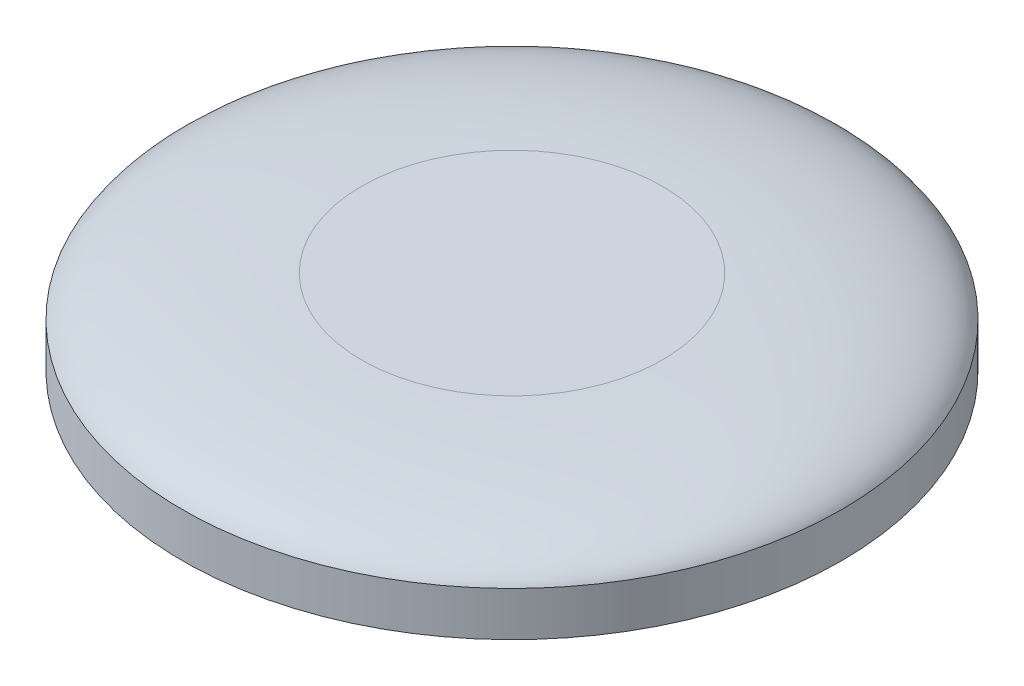
ISO-10303-21;
HEADER;
FILE_DESCRIPTION(('STEP AP214'),'2;1');
FILE_NAME('part.step','',(''),(''),'','','');
FILE_SCHEMA(('AUTOMOTIVE_DESIGN { 1 0 10303 214 1 1 1 1 }'));
ENDSEC;
DATA;
#1=APPLICATION_CONTEXT('core data for automotive mechanical design processes');
#2=APPLICATION_PROTOCOL_DEFINITION('international standard','automotive_design',2000,#1);
#3=PRODUCT_CONTEXT('',#1,'mechanical');
#4=PRODUCT('Part','Part','',(#3));
#5=PRODUCT_RELATED_PRODUCT_CATEGORY('part','',(#4));
#6=PRODUCT_DEFINITION_FORMATION('','',#4);
#7=PRODUCT_DEFINITION_CONTEXT('part definition',#1,'design');
#8=PRODUCT_DEFINITION('design','',#6,#7);
#9=PRODUCT_DEFINITION_SHAPE('','',#8);
#10=(LENGTH_UNIT() NAMED_UNIT(*) SI_UNIT(.MILLI.,.METRE.));
#11=(NAMED_UNIT(*) PLANE_ANGLE_UNIT() SI_UNIT($,.RADIAN.));
#12=(NAMED_UNIT(*) SI_UNIT($,.STERADIAN.) SOLID_ANGLE_UNIT());
#13=UNCERTAINTY_MEASURE_WITH_UNIT(LENGTH_MEASURE(1.E-05),#10,'distance_accuracy_value','');
#14=(GEOMETRIC_REPRESENTATION_CONTEXT(3) GLOBAL_UNCERTAINTY_ASSIGNED_CONTEXT((#13)) GLOBAL_UNIT_ASSIGNED_CONTEXT((#10,
#11,#12)) REPRESENTATION_CONTEXT('',''));
#15=CARTESIAN_POINT('',(0.,0.,0.));
#16=DIRECTION('',(0.,0.,1.));
#17=DIRECTION('',(1.,0.,0.));
#18=AXIS2_PLACEMENT_3D('',#15,#16,#17);
#19=CARTESIAN_POINT('',(0.,-1.56006451025857,0.));
#20=DIRECTION('',(0.,-1.,0.));
#21=DIRECTION('',(1.,0.,0.));
#22=AXIS2_PLACEMENT_3D('',#19,#20,#21);
#23=PLANE('',#22);
#24=CARTESIAN_POINT('',(0.,-1.56006451025857,0.));
#25=DIRECTION('',(0.,1.,0.));
#26=DIRECTION('',(-1.,0.,0.));
#27=AXIS2_PLACEMENT_3D('',#24,#25,#26);
#28=CIRCLE('',#27,13.5169663975414);
#29=CARTESIAN_POINT('',(-13.5169663975414,-1.56006451025857,0.));
#30=VERTEX_POINT('',#29);
#31=EDGE_CURVE('E10',#30,#30,#28,.T.);
#32=ORIENTED_EDGE('',*,*,#31,.F.);
#33=EDGE_LOOP('',(#32));
#34=FACE_BOUND('',#33,.T.);
#35=ADVANCED_FACE('F30',(#34),#23,.T.);
#36=CARTESIAN_POINT('',(0.,-3.40501816722879,0.));
#37=DIRECTION('',(0.,-1.,0.));
#38=DIRECTION('',(1.,0.,0.));
#39=AXIS2_PLACEMENT_3D('',#36,#37,#38);
#40=CONICAL_SURFACE('',#39,23.5,1.38804932371293);
#41=ORIENTED_EDGE('',*,*,#31,.T.);
#42=EDGE_LOOP('',(#41));
#43=FACE_BOUND('',#42,.T.);
#44=CARTESIAN_POINT('',(0.,-3.40501816722879,0.));
#45=DIRECTION('',(0.,1.,0.));
#46=DIRECTION('',(-1.,0.,0.));
#47=AXIS2_PLACEMENT_3D('',#44,#45,#46);
#48=CIRCLE('',#47,23.5);
#49=CARTESIAN_POINT('',(-23.5,-3.40501816722879,0.));
#50=VERTEX_POINT('',#49);
#51=EDGE_CURVE('E36',#50,#50,#48,.T.);
#52=ORIENTED_EDGE('',*,*,#51,.F.);
#53=EDGE_LOOP('',(#52));
#54=FACE_BOUND('',#53,.T.);
#55=ADVANCED_FACE('F92',(#43,#54),#40,.F.);
#56=CARTESIAN_POINT('',(0.,0.,0.));
#57=DIRECTION('',(0.,1.,0.));
#58=DIRECTION('',(-1.,0.,0.));
#59=AXIS2_PLACEMENT_3D('',#56,#57,#58);
#60=CYLINDRICAL_SURFACE('',#59,23.5);
#61=ORIENTED_EDGE('',*,*,#51,.T.);
#62=EDGE_LOOP('',(#61));
#63=FACE_BOUND('',#62,.T.);
#64=CARTESIAN_POINT('',(0.,-5.40501816722879,0.));
#65=DIRECTION('',(0.,1.,0.));
#66=DIRECTION('',(-1.,0.,0.));
#67=AXIS2_PLACEMENT_3D('',#64,#65,#66);
#68=CIRCLE('',#67,23.5);
#69=CARTESIAN_POINT('',(-23.5,-5.40501816722879,0.));
#70=VERTEX_POINT('',#69);
#71=EDGE_CURVE('E40',#70,#70,#68,.T.);
#72=ORIENTED_EDGE('',*,*,#71,.F.);
#73=EDGE_LOOP('',(#72));
#74=FACE_BOUND('',#73,.T.);
#75=ADVANCED_FACE('F89',(#63,#74),#60,.F.);
#76=CARTESIAN_POINT('',(-23.,-5.40501816722879,0.));
#77=DIRECTION('',(0.,1.,0.));
#78=DIRECTION('',(-1.,0.,0.));
#79=AXIS2_PLACEMENT_3D('',#76,#77,#78);
#80=PLANE('',#79);
#81=ORIENTED_EDGE('',*,*,#71,.T.);
#82=EDGE_LOOP('',(#81));
#83=FACE_BOUND('',#82,.T.);
#84=CARTESIAN_POINT('',(0.,-5.40501816722879,0.));
#85=DIRECTION('',(0.,1.,0.));
#86=DIRECTION('',(-1.,0.,0.));
#87=AXIS2_PLACEMENT_3D('',#84,#85,#86);
#88=CIRCLE('',#87,23.);
#89=CARTESIAN_POINT('',(-23.,-5.40501816722879,0.));
#90=VERTEX_POINT('',#89);
#91=EDGE_CURVE('E44',#90,#90,#88,.T.);
#92=ORIENTED_EDGE('',*,*,#91,.F.);
#93=EDGE_LOOP('',(#92));
#94=FACE_BOUND('',#93,.T.);
#95=ADVANCED_FACE('F85',(#83,#94),#80,.T.);
#96=CARTESIAN_POINT('',(0.,0.,0.));
#97=DIRECTION('',(0.,1.,0.));
#98=DIRECTION('',(-1.,0.,0.));
#99=AXIS2_PLACEMENT_3D('',#96,#97,#98);
#100=CYLINDRICAL_SURFACE('',#99,23.);
#101=ORIENTED_EDGE('',*,*,#91,.T.);
#102=EDGE_LOOP('',(#101));
#103=FACE_BOUND('',#102,.T.);
#104=CARTESIAN_POINT('',(0.,-6.40501816722879,0.));
#105=DIRECTION('',(0.,1.,0.));
#106=DIRECTION('',(-1.,0.,0.));
#107=AXIS2_PLACEMENT_3D('',#104,#105,#106);
#108=CIRCLE('',#107,23.);
#109=CARTESIAN_POINT('',(-23.,-6.40501816722879,0.));
#110=VERTEX_POINT('',#109);
#111=EDGE_CURVE('E49',#110,#110,#108,.T.);
#112=ORIENTED_EDGE('',*,*,#111,.F.);
#113=EDGE_LOOP('',(#112));
#114=FACE_BOUND('',#113,.T.);
#115=ADVANCED_FACE('F81',(#103,#114),#100,.F.);
#116=CARTESIAN_POINT('',(-25.,-6.40501816722879,0.));
#117=DIRECTION('',(0.,-1.,0.));
#118=DIRECTION('',(1.,0.,0.));
#119=AXIS2_PLACEMENT_3D('',#116,#117,#118);
#120=PLANE('',#119);
#121=ORIENTED_EDGE('',*,*,#111,.T.);
#122=EDGE_LOOP('',(#121));
#123=FACE_BOUND('',#122,.T.);
#124=CARTESIAN_POINT('',(0.,-6.40501816722879,0.));
#125=DIRECTION('',(0.,1.,0.));
#126=DIRECTION('',(-1.,0.,0.));
#127=AXIS2_PLACEMENT_3D('',#124,#125,#126);
#128=CIRCLE('',#127,25.);
#129=CARTESIAN_POINT('',(-25.,-6.40501816722879,0.));
#130=VERTEX_POINT('',#129);
#131=EDGE_CURVE('E52',#130,#130,#128,.T.);
#132=ORIENTED_EDGE('',*,*,#131,.F.);
#133=EDGE_LOOP('',(#132));
#134=FACE_BOUND('',#133,.T.);
#135=ADVANCED_FACE('F77',(#123,#134),#120,.T.);
#136=CARTESIAN_POINT('',(0.,0.,0.));
#137=DIRECTION('',(0.,1.,0.));
#138=DIRECTION('',(-1.,0.,0.));
#139=AXIS2_PLACEMENT_3D('',#136,#137,#138);
#140=CYLINDRICAL_SURFACE('',#139,25.);
#141=ORIENTED_EDGE('',*,*,#131,.T.);
#142=EDGE_LOOP('',(#141));
#143=FACE_BOUND('',#142,.T.);
#144=CARTESIAN_POINT('',(0.,-3.04322469259653,0.));
#145=DIRECTION('',(0.,1.,0.));
#146=DIRECTION('',(-1.,0.,0.));
#147=AXIS2_PLACEMENT_3D('',#144,#145,#146);
#148=CIRCLE('',#147,25.);
#149=CARTESIAN_POINT('',(-25.,-3.04322469259654,0.));
#150=VERTEX_POINT('',#149);
#151=EDGE_CURVE('E55',#150,#150,#148,.T.);
#152=ORIENTED_EDGE('',*,*,#151,.F.);
#153=EDGE_LOOP('',(#152));
#154=FACE_BOUND('',#153,.T.);
#155=ADVANCED_FACE('F73',(#143,#154),#140,.T.);
#156=CARTESIAN_POINT('',(-11.414353025034,0.,0.));
#157=CARTESIAN_POINT('',(-23.4645195002063,-0.324875606137166,0.));
#158=CARTESIAN_POINT('',(-25.,-3.04322469259654,0.));
#159=B_SPLINE_CURVE_WITH_KNOTS('',2,(#156,#157,#158),.UNSPECIFIED.,.F.,.F.,(3,3),(0.,1.),.UNSPECIFIED.);
#160=CARTESIAN_POINT('',(0.,0.,0.));
#161=DIRECTION('',(0.,1.,0.));
#162=AXIS1_PLACEMENT('',#160,#161);
#163=SURFACE_OF_REVOLUTION('',#159,#162);
#164=ORIENTED_EDGE('',*,*,#151,.T.);
#165=EDGE_LOOP('',(#164));
#166=FACE_BOUND('',#165,.T.);
#167=CARTESIAN_POINT('',(0.,0.,0.));
#168=DIRECTION('',(0.,1.,0.));
#169=DIRECTION('',(-1.,0.,0.));
#170=AXIS2_PLACEMENT_3D('',#167,#168,#169);
#171=CIRCLE('',#170,11.414353025034);
#172=CARTESIAN_POINT('',(-11.414353025034,0.,0.));
#173=VERTEX_POINT('',#172);
#174=EDGE_CURVE('E58',#173,#173,#171,.T.);
#175=ORIENTED_EDGE('',*,*,#174,.F.);
#176=EDGE_LOOP('',(#175));
#177=FACE_BOUND('',#176,.T.);
#178=ADVANCED_FACE('F68',(#166,#177),#163,.F.);
#179=CARTESIAN_POINT('',(0.,0.,0.));
#180=DIRECTION('',(0.,1.,0.));
#181=DIRECTION('',(-1.,0.,0.));
#182=AXIS2_PLACEMENT_3D('',#179,#180,#181);
#183=PLANE('',#182);
#184=ORIENTED_EDGE('',*,*,#174,.T.);
#185=EDGE_LOOP('',(#184));
#186=FACE_BOUND('',#185,.T.);
#187=ADVANCED_FACE('F72',(#186),#183,.T.);
#188=CLOSED_SHELL('',(#35,#55,#75,#95,#115,#135,#155,#178,#187));
#189=MANIFOLD_SOLID_BREP('B2',#188);
#190=ADVANCED_BREP_SHAPE_REPRESENTATION('',(#18,#189),#14);
#191=SHAPE_DEFINITION_REPRESENTATION(#9,#190);
ENDSEC;
END-ISO-10303-21;
